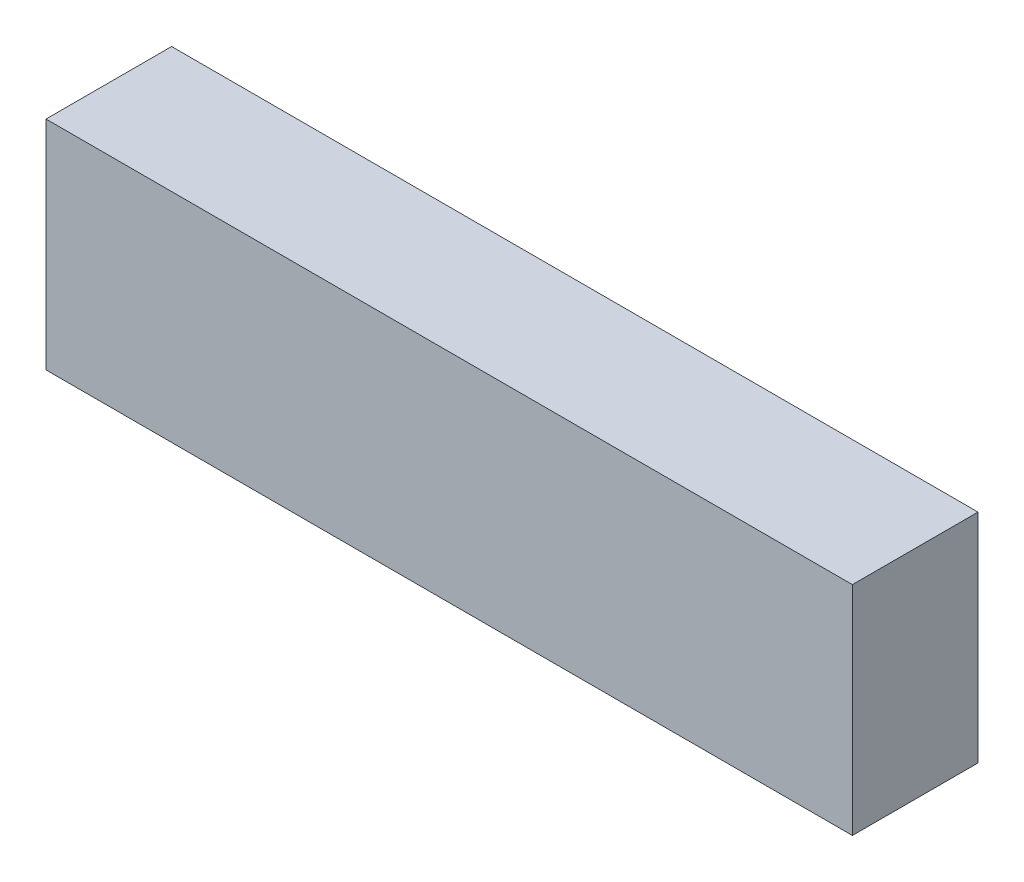
ISO-10303-21;
HEADER;
FILE_DESCRIPTION(('STEP AP214'),'2;1');
FILE_NAME('part.step','',(''),(''),'','','');
FILE_SCHEMA(('AUTOMOTIVE_DESIGN { 1 0 10303 214 1 1 1 1 }'));
ENDSEC;
DATA;
#1=APPLICATION_CONTEXT('core data for automotive mechanical design processes');
#2=APPLICATION_PROTOCOL_DEFINITION('international standard','automotive_design',2000,#1);
#3=PRODUCT_CONTEXT('',#1,'mechanical');
#4=PRODUCT('Part','Part','',(#3));
#5=PRODUCT_RELATED_PRODUCT_CATEGORY('part','',(#4));
#6=PRODUCT_DEFINITION_FORMATION('','',#4);
#7=PRODUCT_DEFINITION_CONTEXT('part definition',#1,'design');
#8=PRODUCT_DEFINITION('design','',#6,#7);
#9=PRODUCT_DEFINITION_SHAPE('','',#8);
#10=(LENGTH_UNIT() NAMED_UNIT(*) SI_UNIT(.MILLI.,.METRE.));
#11=(NAMED_UNIT(*) PLANE_ANGLE_UNIT() SI_UNIT($,.RADIAN.));
#12=(NAMED_UNIT(*) SI_UNIT($,.STERADIAN.) SOLID_ANGLE_UNIT());
#13=UNCERTAINTY_MEASURE_WITH_UNIT(LENGTH_MEASURE(1.E-05),#10,'distance_accuracy_value','');
#14=(GEOMETRIC_REPRESENTATION_CONTEXT(3) GLOBAL_UNCERTAINTY_ASSIGNED_CONTEXT((#13)) GLOBAL_UNIT_ASSIGNED_CONTEXT((#10,
#11,#12)) REPRESENTATION_CONTEXT('',''));
#15=CARTESIAN_POINT('',(0.,0.,0.));
#16=DIRECTION('',(0.,0.,1.));
#17=DIRECTION('',(1.,0.,0.));
#18=AXIS2_PLACEMENT_3D('',#15,#16,#17);
#19=CARTESIAN_POINT('',(-79.0368014902547,46.13,7.25));
#20=DIRECTION('',(1.,0.,0.));
#21=DIRECTION('',(0.,0.,-1.));
#22=AXIS2_PLACEMENT_3D('',#19,#20,#21);
#23=PLANE('',#22);
#24=DIRECTION('',(0.,-1.,0.));
#25=VECTOR('',#24,1.);
#26=CARTESIAN_POINT('',(-79.0368014902547,46.13,0.));
#27=LINE('',#26,#25);
#28=CARTESIAN_POINT('',(-79.0368014902547,46.13,0.));
#29=VERTEX_POINT('',#28);
#30=CARTESIAN_POINT('',(-79.0368014902547,33.59,0.));
#31=VERTEX_POINT('',#30);
#32=EDGE_CURVE('E128',#29,#31,#27,.T.);
#33=ORIENTED_EDGE('',*,*,#32,.T.);
#34=DIRECTION('',(0.,0.,-1.));
#35=VECTOR('',#34,1.);
#36=CARTESIAN_POINT('',(-79.0368014902547,33.59,7.25));
#37=LINE('',#36,#35);
#38=CARTESIAN_POINT('',(-79.0368014902547,33.59,7.25));
#39=VERTEX_POINT('',#38);
#40=EDGE_CURVE('E11',#39,#31,#37,.T.);
#41=ORIENTED_EDGE('',*,*,#40,.F.);
#42=DIRECTION('',(0.,-1.,0.));
#43=VECTOR('',#42,1.);
#44=CARTESIAN_POINT('',(-79.0368014902547,46.13,7.25));
#45=LINE('',#44,#43);
#46=CARTESIAN_POINT('',(-79.0368014902547,46.13,7.25));
#47=VERTEX_POINT('',#46);
#48=EDGE_CURVE('E148',#47,#39,#45,.T.);
#49=ORIENTED_EDGE('',*,*,#48,.F.);
#50=DIRECTION('',(0.,0.,-1.));
#51=VECTOR('',#50,1.);
#52=CARTESIAN_POINT('',(-79.0368014902547,46.13,7.25));
#53=LINE('',#52,#51);
#54=EDGE_CURVE('E153',#47,#29,#53,.T.);
#55=ORIENTED_EDGE('',*,*,#54,.T.);
#56=EDGE_LOOP('',(#33,#41,#49,#55));
#57=FACE_BOUND('',#56,.T.);
#58=ADVANCED_FACE('F32',(#57),#23,.F.);
#59=CARTESIAN_POINT('',(-79.0368014902547,33.59,7.25));
#60=DIRECTION('',(0.,1.,0.));
#61=DIRECTION('',(0.,0.,1.));
#62=AXIS2_PLACEMENT_3D('',#59,#60,#61);
#63=PLANE('',#62);
#64=DIRECTION('',(1.,0.,0.));
#65=VECTOR('',#64,1.);
#66=CARTESIAN_POINT('',(-79.0368014902547,33.59,0.));
#67=LINE('',#66,#65);
#68=CARTESIAN_POINT('',(-32.4954999999996,33.59,0.));
#69=VERTEX_POINT('',#68);
#70=EDGE_CURVE('E132',#31,#69,#67,.T.);
#71=ORIENTED_EDGE('',*,*,#70,.T.);
#72=DIRECTION('',(0.,0.,-1.));
#73=VECTOR('',#72,1.);
#74=CARTESIAN_POINT('',(-32.4954999999996,33.59,7.25));
#75=LINE('',#74,#73);
#76=CARTESIAN_POINT('',(-32.4954999999996,33.59,7.25));
#77=VERTEX_POINT('',#76);
#78=EDGE_CURVE('E39',#77,#69,#75,.T.);
#79=ORIENTED_EDGE('',*,*,#78,.F.);
#80=DIRECTION('',(1.,0.,0.));
#81=VECTOR('',#80,1.);
#82=CARTESIAN_POINT('',(-79.0368014902547,33.59,7.25));
#83=LINE('',#82,#81);
#84=EDGE_CURVE('E83',#39,#77,#83,.T.);
#85=ORIENTED_EDGE('',*,*,#84,.F.);
#86=ORIENTED_EDGE('',*,*,#40,.T.);
#87=EDGE_LOOP('',(#71,#79,#85,#86));
#88=FACE_BOUND('',#87,.T.);
#89=ADVANCED_FACE('F182',(#88),#63,.F.);
#90=CARTESIAN_POINT('',(-32.4954999999996,46.13,7.25));
#91=DIRECTION('',(-1.,0.,0.));
#92=DIRECTION('',(0.,0.,1.));
#93=AXIS2_PLACEMENT_3D('',#90,#91,#92);
#94=PLANE('',#93);
#95=DIRECTION('',(0.,1.,0.));
#96=VECTOR('',#95,1.);
#97=CARTESIAN_POINT('',(-32.4954999999996,46.13,0.));
#98=LINE('',#97,#96);
#99=CARTESIAN_POINT('',(-32.4954999999996,46.13,0.));
#100=VERTEX_POINT('',#99);
#101=EDGE_CURVE('E156',#69,#100,#98,.T.);
#102=ORIENTED_EDGE('',*,*,#101,.T.);
#103=DIRECTION('',(0.,0.,-1.));
#104=VECTOR('',#103,1.);
#105=CARTESIAN_POINT('',(-32.4954999999996,46.13,7.25));
#106=LINE('',#105,#104);
#107=CARTESIAN_POINT('',(-32.4954999999996,46.13,7.25));
#108=VERTEX_POINT('',#107);
#109=EDGE_CURVE('E160',#108,#100,#106,.T.);
#110=ORIENTED_EDGE('',*,*,#109,.F.);
#111=DIRECTION('',(0.,1.,0.));
#112=VECTOR('',#111,1.);
#113=CARTESIAN_POINT('',(-32.4954999999996,46.13,7.25));
#114=LINE('',#113,#112);
#115=EDGE_CURVE('E151',#77,#108,#114,.T.);
#116=ORIENTED_EDGE('',*,*,#115,.F.);
#117=ORIENTED_EDGE('',*,*,#78,.T.);
#118=EDGE_LOOP('',(#102,#110,#116,#117));
#119=FACE_BOUND('',#118,.T.);
#120=ADVANCED_FACE('F165',(#119),#94,.F.);
#121=CARTESIAN_POINT('',(-79.0368014902547,46.13,7.25));
#122=DIRECTION('',(0.,-1.,0.));
#123=DIRECTION('',(0.,0.,-1.));
#124=AXIS2_PLACEMENT_3D('',#121,#122,#123);
#125=PLANE('',#124);
#126=DIRECTION('',(-1.,0.,0.));
#127=VECTOR('',#126,1.);
#128=CARTESIAN_POINT('',(-79.0368014902547,46.13,0.));
#129=LINE('',#128,#127);
#130=EDGE_CURVE('E76',#100,#29,#129,.T.);
#131=ORIENTED_EDGE('',*,*,#130,.T.);
#132=ORIENTED_EDGE('',*,*,#54,.F.);
#133=DIRECTION('',(-1.,0.,0.));
#134=VECTOR('',#133,1.);
#135=CARTESIAN_POINT('',(-79.0368014902547,46.13,7.25));
#136=LINE('',#135,#134);
#137=EDGE_CURVE('E55',#108,#47,#136,.T.);
#138=ORIENTED_EDGE('',*,*,#137,.F.);
#139=ORIENTED_EDGE('',*,*,#109,.T.);
#140=EDGE_LOOP('',(#131,#132,#138,#139));
#141=FACE_BOUND('',#140,.T.);
#142=ADVANCED_FACE('F173',(#141),#125,.F.);
#143=CARTESIAN_POINT('',(0.,0.,7.25));
#144=DIRECTION('',(0.,0.,1.));
#145=DIRECTION('',(1.,0.,0.));
#146=AXIS2_PLACEMENT_3D('',#143,#144,#145);
#147=PLANE('',#146);
#148=ORIENTED_EDGE('',*,*,#48,.T.);
#149=ORIENTED_EDGE('',*,*,#84,.T.);
#150=ORIENTED_EDGE('',*,*,#115,.T.);
#151=ORIENTED_EDGE('',*,*,#137,.T.);
#152=EDGE_LOOP('',(#148,#149,#150,#151));
#153=FACE_BOUND('',#152,.T.);
#154=ADVANCED_FACE('F175',(#153),#147,.T.);
#155=CARTESIAN_POINT('',(0.,0.,0.));
#156=DIRECTION('',(0.,0.,1.));
#157=DIRECTION('',(1.,0.,0.));
#158=AXIS2_PLACEMENT_3D('',#155,#156,#157);
#159=PLANE('',#158);
#160=DIRECTION('',(-1.,0.,0.));
#161=VECTOR('',#160,1.);
#162=CARTESIAN_POINT('',(-79.0368014902547,45.63,0.));
#163=LINE('',#162,#161);
#164=CARTESIAN_POINT('',(-32.9954999999996,45.63,0.));
#165=VERTEX_POINT('',#164);
#166=CARTESIAN_POINT('',(-78.5368014902547,45.63,0.));
#167=VERTEX_POINT('',#166);
#168=EDGE_CURVE('E123',#165,#167,#163,.T.);
#169=ORIENTED_EDGE('',*,*,#168,.T.);
#170=DIRECTION('',(0.,-1.,0.));
#171=VECTOR('',#170,1.);
#172=CARTESIAN_POINT('',(-78.5368014902547,46.13,0.));
#173=LINE('',#172,#171);
#174=CARTESIAN_POINT('',(-78.5368014902547,34.09,0.));
#175=VERTEX_POINT('',#174);
#176=EDGE_CURVE('E142',#167,#175,#173,.T.);
#177=ORIENTED_EDGE('',*,*,#176,.T.);
#178=DIRECTION('',(1.,0.,0.));
#179=VECTOR('',#178,1.);
#180=CARTESIAN_POINT('',(-79.0368014902547,34.09,0.));
#181=LINE('',#180,#179);
#182=CARTESIAN_POINT('',(-32.9954999999996,34.09,0.));
#183=VERTEX_POINT('',#182);
#184=EDGE_CURVE('E127',#175,#183,#181,.T.);
#185=ORIENTED_EDGE('',*,*,#184,.T.);
#186=DIRECTION('',(0.,1.,0.));
#187=VECTOR('',#186,1.);
#188=CARTESIAN_POINT('',(-32.9954999999996,46.13,0.));
#189=LINE('',#188,#187);
#190=EDGE_CURVE('E46',#183,#165,#189,.T.);
#191=ORIENTED_EDGE('',*,*,#190,.T.);
#192=EDGE_LOOP('',(#169,#177,#185,#191));
#193=FACE_BOUND('',#192,.T.);
#194=ORIENTED_EDGE('',*,*,#32,.F.);
#195=ORIENTED_EDGE('',*,*,#130,.F.);
#196=ORIENTED_EDGE('',*,*,#101,.F.);
#197=ORIENTED_EDGE('',*,*,#70,.F.);
#198=EDGE_LOOP('',(#194,#195,#196,#197));
#199=FACE_BOUND('',#198,.T.);
#200=ADVANCED_FACE('F169',(#193,#199),#159,.F.);
#201=CARTESIAN_POINT('',(-78.5368014902547,46.13,7.25));
#202=DIRECTION('',(1.,0.,0.));
#203=DIRECTION('',(0.,0.,-1.));
#204=AXIS2_PLACEMENT_3D('',#201,#202,#203);
#205=PLANE('',#204);
#206=ORIENTED_EDGE('',*,*,#176,.F.);
#207=DIRECTION('',(0.,0.,-1.));
#208=VECTOR('',#207,1.);
#209=CARTESIAN_POINT('',(-78.5368014902547,45.63,7.25));
#210=LINE('',#209,#208);
#211=CARTESIAN_POINT('',(-78.5368014902547,45.63,7.05));
#212=VERTEX_POINT('',#211);
#213=EDGE_CURVE('E122',#212,#167,#210,.T.);
#214=ORIENTED_EDGE('',*,*,#213,.F.);
#215=DIRECTION('',(0.,-1.,0.));
#216=VECTOR('',#215,1.);
#217=CARTESIAN_POINT('',(-78.5368014902547,46.13,7.05));
#218=LINE('',#217,#216);
#219=CARTESIAN_POINT('',(-78.5368014902547,34.09,7.05));
#220=VERTEX_POINT('',#219);
#221=EDGE_CURVE('E110',#212,#220,#218,.T.);
#222=ORIENTED_EDGE('',*,*,#221,.T.);
#223=DIRECTION('',(0.,0.,-1.));
#224=VECTOR('',#223,1.);
#225=CARTESIAN_POINT('',(-78.5368014902547,34.09,7.25));
#226=LINE('',#225,#224);
#227=EDGE_CURVE('E120',#220,#175,#226,.T.);
#228=ORIENTED_EDGE('',*,*,#227,.T.);
#229=EDGE_LOOP('',(#206,#214,#222,#228));
#230=FACE_BOUND('',#229,.T.);
#231=ADVANCED_FACE('F119',(#230),#205,.T.);
#232=CARTESIAN_POINT('',(-79.0368014902547,34.09,7.25));
#233=DIRECTION('',(0.,1.,0.));
#234=DIRECTION('',(0.,0.,1.));
#235=AXIS2_PLACEMENT_3D('',#232,#233,#234);
#236=PLANE('',#235);
#237=ORIENTED_EDGE('',*,*,#184,.F.);
#238=ORIENTED_EDGE('',*,*,#227,.F.);
#239=DIRECTION('',(1.,0.,0.));
#240=VECTOR('',#239,1.);
#241=CARTESIAN_POINT('',(-79.0368014902547,34.09,7.05));
#242=LINE('',#241,#240);
#243=CARTESIAN_POINT('',(-32.9954999999996,34.09,7.05));
#244=VERTEX_POINT('',#243);
#245=EDGE_CURVE('E106',#220,#244,#242,.T.);
#246=ORIENTED_EDGE('',*,*,#245,.T.);
#247=DIRECTION('',(0.,0.,-1.));
#248=VECTOR('',#247,1.);
#249=CARTESIAN_POINT('',(-32.9954999999996,34.09,7.25));
#250=LINE('',#249,#248);
#251=EDGE_CURVE('E129',#244,#183,#250,.T.);
#252=ORIENTED_EDGE('',*,*,#251,.T.);
#253=EDGE_LOOP('',(#237,#238,#246,#252));
#254=FACE_BOUND('',#253,.T.);
#255=ADVANCED_FACE('F125',(#254),#236,.T.);
#256=CARTESIAN_POINT('',(-32.9954999999996,46.13,7.25));
#257=DIRECTION('',(-1.,0.,0.));
#258=DIRECTION('',(0.,0.,1.));
#259=AXIS2_PLACEMENT_3D('',#256,#257,#258);
#260=PLANE('',#259);
#261=ORIENTED_EDGE('',*,*,#190,.F.);
#262=ORIENTED_EDGE('',*,*,#251,.F.);
#263=DIRECTION('',(0.,1.,0.));
#264=VECTOR('',#263,1.);
#265=CARTESIAN_POINT('',(-32.9954999999996,46.13,7.05));
#266=LINE('',#265,#264);
#267=CARTESIAN_POINT('',(-32.9954999999996,45.63,7.05));
#268=VERTEX_POINT('',#267);
#269=EDGE_CURVE('E111',#244,#268,#266,.T.);
#270=ORIENTED_EDGE('',*,*,#269,.T.);
#271=DIRECTION('',(0.,0.,-1.));
#272=VECTOR('',#271,1.);
#273=CARTESIAN_POINT('',(-32.9954999999996,45.63,7.25));
#274=LINE('',#273,#272);
#275=EDGE_CURVE('E134',#268,#165,#274,.T.);
#276=ORIENTED_EDGE('',*,*,#275,.T.);
#277=EDGE_LOOP('',(#261,#262,#270,#276));
#278=FACE_BOUND('',#277,.T.);
#279=ADVANCED_FACE('F230',(#278),#260,.T.);
#280=CARTESIAN_POINT('',(-79.0368014902547,45.63,7.25));
#281=DIRECTION('',(0.,-1.,0.));
#282=DIRECTION('',(0.,0.,-1.));
#283=AXIS2_PLACEMENT_3D('',#280,#281,#282);
#284=PLANE('',#283);
#285=ORIENTED_EDGE('',*,*,#168,.F.);
#286=ORIENTED_EDGE('',*,*,#275,.F.);
#287=DIRECTION('',(-1.,0.,0.));
#288=VECTOR('',#287,1.);
#289=CARTESIAN_POINT('',(-79.0368014902547,45.63,7.05));
#290=LINE('',#289,#288);
#291=EDGE_CURVE('E137',#268,#212,#290,.T.);
#292=ORIENTED_EDGE('',*,*,#291,.T.);
#293=ORIENTED_EDGE('',*,*,#213,.T.);
#294=EDGE_LOOP('',(#285,#286,#292,#293));
#295=FACE_BOUND('',#294,.T.);
#296=ADVANCED_FACE('F239',(#295),#284,.T.);
#297=CARTESIAN_POINT('',(0.,0.,7.05));
#298=DIRECTION('',(0.,0.,1.));
#299=DIRECTION('',(1.,0.,0.));
#300=AXIS2_PLACEMENT_3D('',#297,#298,#299);
#301=PLANE('',#300);
#302=ORIENTED_EDGE('',*,*,#221,.F.);
#303=ORIENTED_EDGE('',*,*,#291,.F.);
#304=ORIENTED_EDGE('',*,*,#269,.F.);
#305=ORIENTED_EDGE('',*,*,#245,.F.);
#306=EDGE_LOOP('',(#302,#303,#304,#305));
#307=FACE_BOUND('',#306,.T.);
#308=ADVANCED_FACE('F108',(#307),#301,.F.);
#309=CLOSED_SHELL('',(#58,#89,#120,#142,#154,#200,#231,#255,#279,#296,#308));
#310=MANIFOLD_SOLID_BREP('B2',#309);
#311=ADVANCED_BREP_SHAPE_REPRESENTATION('',(#18,#310),#14);
#312=SHAPE_DEFINITION_REPRESENTATION(#9,#311);
ENDSEC;
END-ISO-10303-21;
